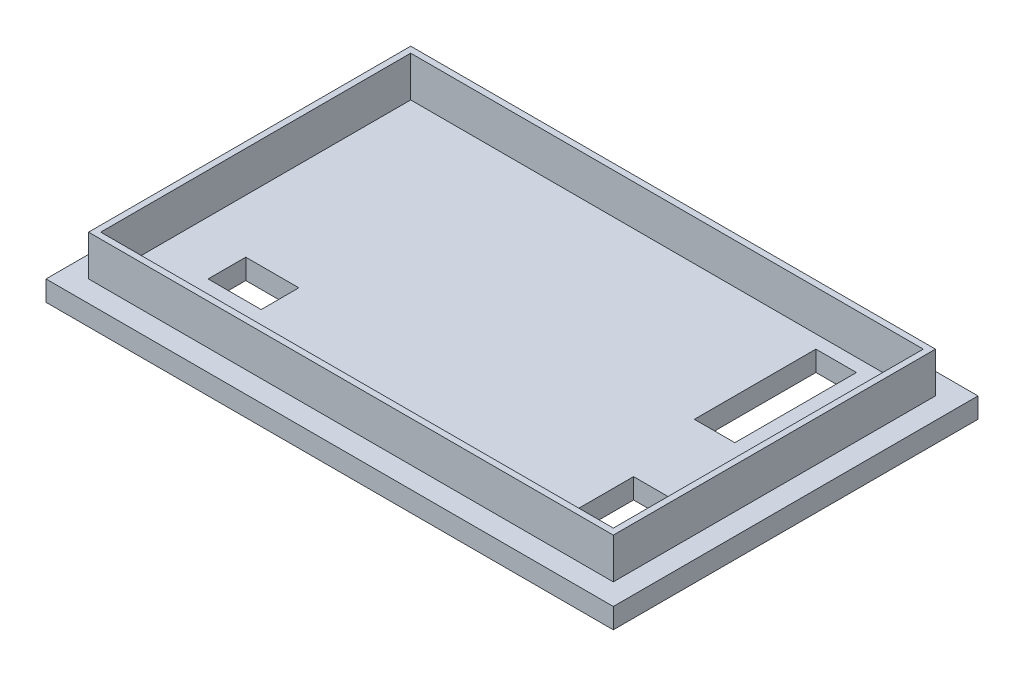
ISO-10303-21;
HEADER;
FILE_DESCRIPTION(('STEP AP214'),'2;1');
FILE_NAME('part.step','',(''),(''),'','','');
FILE_SCHEMA(('AUTOMOTIVE_DESIGN { 1 0 10303 214 1 1 1 1 }'));
ENDSEC;
DATA;
#1=APPLICATION_CONTEXT('core data for automotive mechanical design processes');
#2=APPLICATION_PROTOCOL_DEFINITION('international standard','automotive_design',2000,#1);
#3=PRODUCT_CONTEXT('',#1,'mechanical');
#4=PRODUCT('Part','Part','',(#3));
#5=PRODUCT_RELATED_PRODUCT_CATEGORY('part','',(#4));
#6=PRODUCT_DEFINITION_FORMATION('','',#4);
#7=PRODUCT_DEFINITION_CONTEXT('part definition',#1,'design');
#8=PRODUCT_DEFINITION('design','',#6,#7);
#9=PRODUCT_DEFINITION_SHAPE('','',#8);
#10=(LENGTH_UNIT() NAMED_UNIT(*) SI_UNIT(.MILLI.,.METRE.));
#11=(NAMED_UNIT(*) PLANE_ANGLE_UNIT() SI_UNIT($,.RADIAN.));
#12=(NAMED_UNIT(*) SI_UNIT($,.STERADIAN.) SOLID_ANGLE_UNIT());
#13=UNCERTAINTY_MEASURE_WITH_UNIT(LENGTH_MEASURE(1.E-05),#10,'distance_accuracy_value','');
#14=(GEOMETRIC_REPRESENTATION_CONTEXT(3) GLOBAL_UNCERTAINTY_ASSIGNED_CONTEXT((#13)) GLOBAL_UNIT_ASSIGNED_CONTEXT((#10,
#11,#12)) REPRESENTATION_CONTEXT('',''));
#15=CARTESIAN_POINT('',(0.,0.,0.));
#16=DIRECTION('',(0.,0.,1.));
#17=DIRECTION('',(1.,0.,0.));
#18=AXIS2_PLACEMENT_3D('',#15,#16,#17);
#19=CARTESIAN_POINT('',(0.,5.,0.));
#20=DIRECTION('',(0.,1.,0.));
#21=DIRECTION('',(0.,0.,1.));
#22=AXIS2_PLACEMENT_3D('',#19,#20,#21);
#23=PLANE('',#22);
#24=DIRECTION('',(0.,0.,-1.));
#25=VECTOR('',#24,1.);
#26=CARTESIAN_POINT('',(70.,5.,-45.));
#27=LINE('',#26,#25);
#28=CARTESIAN_POINT('',(70.,5.,45.));
#29=VERTEX_POINT('',#28);
#30=CARTESIAN_POINT('',(70.,5.,-45.));
#31=VERTEX_POINT('',#30);
#32=EDGE_CURVE('E336',#29,#31,#27,.T.);
#33=ORIENTED_EDGE('',*,*,#32,.T.);
#34=DIRECTION('',(-1.,0.,0.));
#35=VECTOR('',#34,1.);
#36=CARTESIAN_POINT('',(-70.,5.,-45.));
#37=LINE('',#36,#35);
#38=CARTESIAN_POINT('',(-70.,5.,-45.));
#39=VERTEX_POINT('',#38);
#40=EDGE_CURVE('E339',#31,#39,#37,.T.);
#41=ORIENTED_EDGE('',*,*,#40,.T.);
#42=DIRECTION('',(0.,0.,1.));
#43=VECTOR('',#42,1.);
#44=CARTESIAN_POINT('',(-70.,5.,-45.));
#45=LINE('',#44,#43);
#46=CARTESIAN_POINT('',(-70.,5.,45.));
#47=VERTEX_POINT('',#46);
#48=EDGE_CURVE('E342',#39,#47,#45,.T.);
#49=ORIENTED_EDGE('',*,*,#48,.T.);
#50=DIRECTION('',(1.,0.,0.));
#51=VECTOR('',#50,1.);
#52=CARTESIAN_POINT('',(-70.,5.,45.));
#53=LINE('',#52,#51);
#54=EDGE_CURVE('E344',#47,#29,#53,.T.);
#55=ORIENTED_EDGE('',*,*,#54,.T.);
#56=EDGE_LOOP('',(#33,#41,#49,#55));
#57=FACE_BOUND('',#56,.T.);
#58=DIRECTION('',(-1.,0.,0.));
#59=VECTOR('',#58,1.);
#60=CARTESIAN_POINT('',(-64.75,5.,-39.75));
#61=LINE('',#60,#59);
#62=CARTESIAN_POINT('',(64.75,5.,-39.75));
#63=VERTEX_POINT('',#62);
#64=CARTESIAN_POINT('',(-64.75,5.,-39.75));
#65=VERTEX_POINT('',#64);
#66=EDGE_CURVE('E320',#63,#65,#61,.T.);
#67=ORIENTED_EDGE('',*,*,#66,.F.);
#68=DIRECTION('',(0.,0.,-1.));
#69=VECTOR('',#68,1.);
#70=CARTESIAN_POINT('',(64.75,5.,-39.75));
#71=LINE('',#70,#69);
#72=CARTESIAN_POINT('',(64.75,5.,39.75));
#73=VERTEX_POINT('',#72);
#74=EDGE_CURVE('E306',#73,#63,#71,.T.);
#75=ORIENTED_EDGE('',*,*,#74,.F.);
#76=DIRECTION('',(1.,0.,0.));
#77=VECTOR('',#76,1.);
#78=CARTESIAN_POINT('',(-64.75,5.,39.75));
#79=LINE('',#78,#77);
#80=CARTESIAN_POINT('',(-64.75,5.,39.75));
#81=VERTEX_POINT('',#80);
#82=EDGE_CURVE('E311',#81,#73,#79,.T.);
#83=ORIENTED_EDGE('',*,*,#82,.F.);
#84=DIRECTION('',(0.,0.,1.));
#85=VECTOR('',#84,1.);
#86=CARTESIAN_POINT('',(-64.75,5.,-39.75));
#87=LINE('',#86,#85);
#88=EDGE_CURVE('E322',#65,#81,#87,.T.);
#89=ORIENTED_EDGE('',*,*,#88,.F.);
#90=EDGE_LOOP('',(#67,#75,#83,#89));
#91=FACE_BOUND('',#90,.T.);
#92=ADVANCED_FACE('F37',(#57,#91),#23,.T.);
#93=CARTESIAN_POINT('',(70.,5.,-45.));
#94=DIRECTION('',(-1.,0.,0.));
#95=DIRECTION('',(0.,0.,1.));
#96=AXIS2_PLACEMENT_3D('',#93,#94,#95);
#97=PLANE('',#96);
#98=DIRECTION('',(0.,0.,-1.));
#99=VECTOR('',#98,1.);
#100=CARTESIAN_POINT('',(70.,0.,-45.));
#101=LINE('',#100,#99);
#102=CARTESIAN_POINT('',(70.,0.,45.));
#103=VERTEX_POINT('',#102);
#104=CARTESIAN_POINT('',(70.,0.,-45.));
#105=VERTEX_POINT('',#104);
#106=EDGE_CURVE('E335',#103,#105,#101,.T.);
#107=ORIENTED_EDGE('',*,*,#106,.T.);
#108=DIRECTION('',(0.,-1.,0.));
#109=VECTOR('',#108,1.);
#110=CARTESIAN_POINT('',(70.,5.,-45.));
#111=LINE('',#110,#109);
#112=EDGE_CURVE('E362',#31,#105,#111,.T.);
#113=ORIENTED_EDGE('',*,*,#112,.F.);
#114=ORIENTED_EDGE('',*,*,#32,.F.);
#115=DIRECTION('',(0.,-1.,0.));
#116=VECTOR('',#115,1.);
#117=CARTESIAN_POINT('',(70.,5.,45.));
#118=LINE('',#117,#116);
#119=EDGE_CURVE('E346',#29,#103,#118,.T.);
#120=ORIENTED_EDGE('',*,*,#119,.T.);
#121=EDGE_LOOP('',(#107,#113,#114,#120));
#122=FACE_BOUND('',#121,.T.);
#123=ADVANCED_FACE('F39',(#122),#97,.F.);
#124=CARTESIAN_POINT('',(-70.,5.,-45.));
#125=DIRECTION('',(0.,0.,1.));
#126=DIRECTION('',(1.,0.,0.));
#127=AXIS2_PLACEMENT_3D('',#124,#125,#126);
#128=PLANE('',#127);
#129=DIRECTION('',(-1.,0.,0.));
#130=VECTOR('',#129,1.);
#131=CARTESIAN_POINT('',(-70.,0.,-45.));
#132=LINE('',#131,#130);
#133=CARTESIAN_POINT('',(-70.,0.,-45.));
#134=VERTEX_POINT('',#133);
#135=EDGE_CURVE('E349',#105,#134,#132,.T.);
#136=ORIENTED_EDGE('',*,*,#135,.T.);
#137=DIRECTION('',(0.,-1.,0.));
#138=VECTOR('',#137,1.);
#139=CARTESIAN_POINT('',(-70.,5.,-45.));
#140=LINE('',#139,#138);
#141=EDGE_CURVE('E359',#39,#134,#140,.T.);
#142=ORIENTED_EDGE('',*,*,#141,.F.);
#143=ORIENTED_EDGE('',*,*,#40,.F.);
#144=ORIENTED_EDGE('',*,*,#112,.T.);
#145=EDGE_LOOP('',(#136,#142,#143,#144));
#146=FACE_BOUND('',#145,.T.);
#147=ADVANCED_FACE('F404',(#146),#128,.F.);
#148=CARTESIAN_POINT('',(-70.,5.,-45.));
#149=DIRECTION('',(1.,0.,0.));
#150=DIRECTION('',(0.,0.,-1.));
#151=AXIS2_PLACEMENT_3D('',#148,#149,#150);
#152=PLANE('',#151);
#153=DIRECTION('',(0.,0.,1.));
#154=VECTOR('',#153,1.);
#155=CARTESIAN_POINT('',(-70.,0.,-45.));
#156=LINE('',#155,#154);
#157=CARTESIAN_POINT('',(-70.,0.,45.));
#158=VERTEX_POINT('',#157);
#159=EDGE_CURVE('E351',#134,#158,#156,.T.);
#160=ORIENTED_EDGE('',*,*,#159,.T.);
#161=DIRECTION('',(0.,-1.,0.));
#162=VECTOR('',#161,1.);
#163=CARTESIAN_POINT('',(-70.,5.,45.));
#164=LINE('',#163,#162);
#165=EDGE_CURVE('E356',#47,#158,#164,.T.);
#166=ORIENTED_EDGE('',*,*,#165,.F.);
#167=ORIENTED_EDGE('',*,*,#48,.F.);
#168=ORIENTED_EDGE('',*,*,#141,.T.);
#169=EDGE_LOOP('',(#160,#166,#167,#168));
#170=FACE_BOUND('',#169,.T.);
#171=ADVANCED_FACE('F691',(#170),#152,.F.);
#172=CARTESIAN_POINT('',(-70.,5.,45.));
#173=DIRECTION('',(0.,0.,-1.));
#174=DIRECTION('',(-1.,0.,0.));
#175=AXIS2_PLACEMENT_3D('',#172,#173,#174);
#176=PLANE('',#175);
#177=DIRECTION('',(1.,0.,0.));
#178=VECTOR('',#177,1.);
#179=CARTESIAN_POINT('',(-70.,0.,45.));
#180=LINE('',#179,#178);
#181=EDGE_CURVE('E340',#158,#103,#180,.T.);
#182=ORIENTED_EDGE('',*,*,#181,.T.);
#183=ORIENTED_EDGE('',*,*,#119,.F.);
#184=ORIENTED_EDGE('',*,*,#54,.F.);
#185=ORIENTED_EDGE('',*,*,#165,.T.);
#186=EDGE_LOOP('',(#182,#183,#184,#185));
#187=FACE_BOUND('',#186,.T.);
#188=ADVANCED_FACE('F598',(#187),#176,.F.);
#189=CARTESIAN_POINT('',(0.,0.,0.));
#190=DIRECTION('',(0.,1.,0.));
#191=DIRECTION('',(0.,0.,1.));
#192=AXIS2_PLACEMENT_3D('',#189,#190,#191);
#193=PLANE('',#192);
#194=DIRECTION('',(-1.,0.,0.));
#195=VECTOR('',#194,1.);
#196=CARTESIAN_POINT('',(40.,0.,-5.));
#197=LINE('',#196,#195);
#198=CARTESIAN_POINT('',(50.,0.,-5.));
#199=VERTEX_POINT('',#198);
#200=CARTESIAN_POINT('',(40.,0.,-5.));
#201=VERTEX_POINT('',#200);
#202=EDGE_CURVE('E209',#199,#201,#197,.T.);
#203=ORIENTED_EDGE('',*,*,#202,.F.);
#204=DIRECTION('',(0.,0.,1.));
#205=VECTOR('',#204,1.);
#206=CARTESIAN_POINT('',(50.,0.,-35.));
#207=LINE('',#206,#205);
#208=CARTESIAN_POINT('',(50.,0.,-35.));
#209=VERTEX_POINT('',#208);
#210=EDGE_CURVE('E52',#209,#199,#207,.T.);
#211=ORIENTED_EDGE('',*,*,#210,.F.);
#212=DIRECTION('',(1.,0.,0.));
#213=VECTOR('',#212,1.);
#214=CARTESIAN_POINT('',(40.,0.,-35.));
#215=LINE('',#214,#213);
#216=CARTESIAN_POINT('',(40.,0.,-35.));
#217=VERTEX_POINT('',#216);
#218=EDGE_CURVE('E216',#217,#209,#215,.T.);
#219=ORIENTED_EDGE('',*,*,#218,.F.);
#220=DIRECTION('',(0.,0.,-1.));
#221=VECTOR('',#220,1.);
#222=CARTESIAN_POINT('',(40.,0.,-35.));
#223=LINE('',#222,#221);
#224=EDGE_CURVE('E200',#201,#217,#223,.T.);
#225=ORIENTED_EDGE('',*,*,#224,.F.);
#226=EDGE_LOOP('',(#203,#211,#219,#225));
#227=FACE_BOUND('',#226,.T.);
#228=DIRECTION('',(-1.,0.,0.));
#229=VECTOR('',#228,1.);
#230=CARTESIAN_POINT('',(-50.,0.,25.));
#231=LINE('',#230,#229);
#232=CARTESIAN_POINT('',(-36.9,0.,25.));
#233=VERTEX_POINT('',#232);
#234=CARTESIAN_POINT('',(-50.,0.,25.));
#235=VERTEX_POINT('',#234);
#236=EDGE_CURVE('E227',#233,#235,#231,.T.);
#237=ORIENTED_EDGE('',*,*,#236,.F.);
#238=DIRECTION('',(0.,0.,1.));
#239=VECTOR('',#238,1.);
#240=CARTESIAN_POINT('',(-36.9,0.,25.));
#241=LINE('',#240,#239);
#242=CARTESIAN_POINT('',(-36.9,0.,15.7));
#243=VERTEX_POINT('',#242);
#244=EDGE_CURVE('E223',#243,#233,#241,.T.);
#245=ORIENTED_EDGE('',*,*,#244,.F.);
#246=DIRECTION('',(1.,0.,0.));
#247=VECTOR('',#246,1.);
#248=CARTESIAN_POINT('',(-50.,0.,15.7));
#249=LINE('',#248,#247);
#250=CARTESIAN_POINT('',(-50.,0.,15.7));
#251=VERTEX_POINT('',#250);
#252=EDGE_CURVE('E233',#251,#243,#249,.T.);
#253=ORIENTED_EDGE('',*,*,#252,.F.);
#254=DIRECTION('',(0.,0.,-1.));
#255=VECTOR('',#254,1.);
#256=CARTESIAN_POINT('',(-50.,0.,25.));
#257=LINE('',#256,#255);
#258=EDGE_CURVE('E230',#235,#251,#257,.T.);
#259=ORIENTED_EDGE('',*,*,#258,.F.);
#260=EDGE_LOOP('',(#237,#245,#253,#259));
#261=FACE_BOUND('',#260,.T.);
#262=DIRECTION('',(1.,0.,0.));
#263=VECTOR('',#262,1.);
#264=CARTESIAN_POINT('',(44.75,0.,34.75));
#265=LINE('',#264,#263);
#266=CARTESIAN_POINT('',(44.75,0.,34.75));
#267=VERTEX_POINT('',#266);
#268=CARTESIAN_POINT('',(59.75,0.,34.75));
#269=VERTEX_POINT('',#268);
#270=EDGE_CURVE('E256',#267,#269,#265,.T.);
#271=ORIENTED_EDGE('',*,*,#270,.T.);
#272=DIRECTION('',(0.,0.,-1.));
#273=VECTOR('',#272,1.);
#274=CARTESIAN_POINT('',(59.75,0.,14.75));
#275=LINE('',#274,#273);
#276=CARTESIAN_POINT('',(59.75,0.,14.75));
#277=VERTEX_POINT('',#276);
#278=EDGE_CURVE('E246',#269,#277,#275,.T.);
#279=ORIENTED_EDGE('',*,*,#278,.T.);
#280=DIRECTION('',(-1.,0.,0.));
#281=VECTOR('',#280,1.);
#282=CARTESIAN_POINT('',(44.75,0.,14.75));
#283=LINE('',#282,#281);
#284=CARTESIAN_POINT('',(44.75,0.,14.75));
#285=VERTEX_POINT('',#284);
#286=EDGE_CURVE('E249',#277,#285,#283,.T.);
#287=ORIENTED_EDGE('',*,*,#286,.T.);
#288=DIRECTION('',(0.,0.,1.));
#289=VECTOR('',#288,1.);
#290=CARTESIAN_POINT('',(44.75,0.,14.75));
#291=LINE('',#290,#289);
#292=EDGE_CURVE('E253',#285,#267,#291,.T.);
#293=ORIENTED_EDGE('',*,*,#292,.T.);
#294=EDGE_LOOP('',(#271,#279,#287,#293));
#295=FACE_BOUND('',#294,.T.);
#296=ORIENTED_EDGE('',*,*,#106,.F.);
#297=ORIENTED_EDGE('',*,*,#181,.F.);
#298=ORIENTED_EDGE('',*,*,#159,.F.);
#299=ORIENTED_EDGE('',*,*,#135,.F.);
#300=EDGE_LOOP('',(#296,#297,#298,#299));
#301=FACE_BOUND('',#300,.T.);
#302=ADVANCED_FACE('F213',(#227,#261,#295,#301),#193,.F.);
#303=CARTESIAN_POINT('',(0.,15.,0.));
#304=DIRECTION('',(0.,1.,0.));
#305=DIRECTION('',(0.,0.,1.));
#306=AXIS2_PLACEMENT_3D('',#303,#304,#305);
#307=PLANE('',#306);
#308=DIRECTION('',(0.,0.,-1.));
#309=VECTOR('',#308,1.);
#310=CARTESIAN_POINT('',(64.75,15.,-39.75));
#311=LINE('',#310,#309);
#312=CARTESIAN_POINT('',(64.75,15.,39.75));
#313=VERTEX_POINT('',#312);
#314=CARTESIAN_POINT('',(64.75,15.,-39.75));
#315=VERTEX_POINT('',#314);
#316=EDGE_CURVE('E307',#313,#315,#311,.T.);
#317=ORIENTED_EDGE('',*,*,#316,.T.);
#318=DIRECTION('',(-1.,0.,0.));
#319=VECTOR('',#318,1.);
#320=CARTESIAN_POINT('',(-64.75,15.,-39.75));
#321=LINE('',#320,#319);
#322=CARTESIAN_POINT('',(-64.75,15.,-39.75));
#323=VERTEX_POINT('',#322);
#324=EDGE_CURVE('E310',#315,#323,#321,.T.);
#325=ORIENTED_EDGE('',*,*,#324,.T.);
#326=DIRECTION('',(0.,0.,1.));
#327=VECTOR('',#326,1.);
#328=CARTESIAN_POINT('',(-64.75,15.,-39.75));
#329=LINE('',#328,#327);
#330=CARTESIAN_POINT('',(-64.75,15.,39.75));
#331=VERTEX_POINT('',#330);
#332=EDGE_CURVE('E313',#323,#331,#329,.T.);
#333=ORIENTED_EDGE('',*,*,#332,.T.);
#334=DIRECTION('',(1.,0.,0.));
#335=VECTOR('',#334,1.);
#336=CARTESIAN_POINT('',(-64.75,15.,39.75));
#337=LINE('',#336,#335);
#338=EDGE_CURVE('E315',#331,#313,#337,.T.);
#339=ORIENTED_EDGE('',*,*,#338,.T.);
#340=EDGE_LOOP('',(#317,#325,#333,#339));
#341=FACE_BOUND('',#340,.T.);
#342=DIRECTION('',(-1.,0.,0.));
#343=VECTOR('',#342,1.);
#344=CARTESIAN_POINT('',(-63.25,15.,-38.25));
#345=LINE('',#344,#343);
#346=CARTESIAN_POINT('',(63.25,15.,-38.25));
#347=VERTEX_POINT('',#346);
#348=CARTESIAN_POINT('',(-63.25,15.,-38.25));
#349=VERTEX_POINT('',#348);
#350=EDGE_CURVE('E280',#347,#349,#345,.T.);
#351=ORIENTED_EDGE('',*,*,#350,.F.);
#352=DIRECTION('',(0.,0.,-1.));
#353=VECTOR('',#352,1.);
#354=CARTESIAN_POINT('',(63.25,15.,-38.25));
#355=LINE('',#354,#353);
#356=CARTESIAN_POINT('',(63.25,15.,38.25));
#357=VERTEX_POINT('',#356);
#358=EDGE_CURVE('E278',#357,#347,#355,.T.);
#359=ORIENTED_EDGE('',*,*,#358,.F.);
#360=DIRECTION('',(1.,0.,0.));
#361=VECTOR('',#360,1.);
#362=CARTESIAN_POINT('',(-63.25,15.,38.25));
#363=LINE('',#362,#361);
#364=CARTESIAN_POINT('',(-63.25,15.,38.25));
#365=VERTEX_POINT('',#364);
#366=EDGE_CURVE('E286',#365,#357,#363,.T.);
#367=ORIENTED_EDGE('',*,*,#366,.F.);
#368=DIRECTION('',(0.,0.,1.));
#369=VECTOR('',#368,1.);
#370=CARTESIAN_POINT('',(-63.25,15.,-38.25));
#371=LINE('',#370,#369);
#372=EDGE_CURVE('E283',#349,#365,#371,.T.);
#373=ORIENTED_EDGE('',*,*,#372,.F.);
#374=EDGE_LOOP('',(#351,#359,#367,#373));
#375=FACE_BOUND('',#374,.T.);
#376=ADVANCED_FACE('F439',(#341,#375),#307,.T.);
#377=CARTESIAN_POINT('',(64.75,15.,-39.75));
#378=DIRECTION('',(-1.,0.,0.));
#379=DIRECTION('',(0.,0.,1.));
#380=AXIS2_PLACEMENT_3D('',#377,#378,#379);
#381=PLANE('',#380);
#382=ORIENTED_EDGE('',*,*,#74,.T.);
#383=DIRECTION('',(0.,-1.,0.));
#384=VECTOR('',#383,1.);
#385=CARTESIAN_POINT('',(64.75,15.,-39.75));
#386=LINE('',#385,#384);
#387=EDGE_CURVE('E333',#315,#63,#386,.T.);
#388=ORIENTED_EDGE('',*,*,#387,.F.);
#389=ORIENTED_EDGE('',*,*,#316,.F.);
#390=DIRECTION('',(0.,-1.,0.));
#391=VECTOR('',#390,1.);
#392=CARTESIAN_POINT('',(64.75,15.,39.75));
#393=LINE('',#392,#391);
#394=EDGE_CURVE('E317',#313,#73,#393,.T.);
#395=ORIENTED_EDGE('',*,*,#394,.T.);
#396=EDGE_LOOP('',(#382,#388,#389,#395));
#397=FACE_BOUND('',#396,.T.);
#398=ADVANCED_FACE('F442',(#397),#381,.F.);
#399=CARTESIAN_POINT('',(-64.75,15.,-39.75));
#400=DIRECTION('',(0.,0.,1.));
#401=DIRECTION('',(1.,0.,0.));
#402=AXIS2_PLACEMENT_3D('',#399,#400,#401);
#403=PLANE('',#402);
#404=ORIENTED_EDGE('',*,*,#66,.T.);
#405=DIRECTION('',(0.,-1.,0.));
#406=VECTOR('',#405,1.);
#407=CARTESIAN_POINT('',(-64.75,15.,-39.75));
#408=LINE('',#407,#406);
#409=EDGE_CURVE('E330',#323,#65,#408,.T.);
#410=ORIENTED_EDGE('',*,*,#409,.F.);
#411=ORIENTED_EDGE('',*,*,#324,.F.);
#412=ORIENTED_EDGE('',*,*,#387,.T.);
#413=EDGE_LOOP('',(#404,#410,#411,#412));
#414=FACE_BOUND('',#413,.T.);
#415=ADVANCED_FACE('F450',(#414),#403,.F.);
#416=CARTESIAN_POINT('',(-64.75,15.,-39.75));
#417=DIRECTION('',(1.,0.,0.));
#418=DIRECTION('',(0.,0.,-1.));
#419=AXIS2_PLACEMENT_3D('',#416,#417,#418);
#420=PLANE('',#419);
#421=ORIENTED_EDGE('',*,*,#88,.T.);
#422=DIRECTION('',(0.,-1.,0.));
#423=VECTOR('',#422,1.);
#424=CARTESIAN_POINT('',(-64.75,15.,39.75));
#425=LINE('',#424,#423);
#426=EDGE_CURVE('E328',#331,#81,#425,.T.);
#427=ORIENTED_EDGE('',*,*,#426,.F.);
#428=ORIENTED_EDGE('',*,*,#332,.F.);
#429=ORIENTED_EDGE('',*,*,#409,.T.);
#430=EDGE_LOOP('',(#421,#427,#428,#429));
#431=FACE_BOUND('',#430,.T.);
#432=ADVANCED_FACE('F446',(#431),#420,.F.);
#433=CARTESIAN_POINT('',(-64.75,15.,39.75));
#434=DIRECTION('',(0.,0.,-1.));
#435=DIRECTION('',(-1.,0.,0.));
#436=AXIS2_PLACEMENT_3D('',#433,#434,#435);
#437=PLANE('',#436);
#438=ORIENTED_EDGE('',*,*,#82,.T.);
#439=ORIENTED_EDGE('',*,*,#394,.F.);
#440=ORIENTED_EDGE('',*,*,#338,.F.);
#441=ORIENTED_EDGE('',*,*,#426,.T.);
#442=EDGE_LOOP('',(#438,#439,#440,#441));
#443=FACE_BOUND('',#442,.T.);
#444=ADVANCED_FACE('F437',(#443),#437,.F.);
#445=CARTESIAN_POINT('',(63.25,15.,-38.25));
#446=DIRECTION('',(-1.,0.,0.));
#447=DIRECTION('',(0.,0.,1.));
#448=AXIS2_PLACEMENT_3D('',#445,#446,#447);
#449=PLANE('',#448);
#450=DIRECTION('',(0.,0.,-1.));
#451=VECTOR('',#450,1.);
#452=CARTESIAN_POINT('',(63.25,5.,-38.25));
#453=LINE('',#452,#451);
#454=CARTESIAN_POINT('',(63.25,5.,38.25));
#455=VERTEX_POINT('',#454);
#456=CARTESIAN_POINT('',(63.25,5.,-38.25));
#457=VERTEX_POINT('',#456);
#458=EDGE_CURVE('E271',#455,#457,#453,.T.);
#459=ORIENTED_EDGE('',*,*,#458,.F.);
#460=DIRECTION('',(0.,-1.,0.));
#461=VECTOR('',#460,1.);
#462=CARTESIAN_POINT('',(63.25,15.,38.25));
#463=LINE('',#462,#461);
#464=EDGE_CURVE('E288',#357,#455,#463,.T.);
#465=ORIENTED_EDGE('',*,*,#464,.F.);
#466=ORIENTED_EDGE('',*,*,#358,.T.);
#467=DIRECTION('',(0.,-1.,0.));
#468=VECTOR('',#467,1.);
#469=CARTESIAN_POINT('',(63.25,15.,-38.25));
#470=LINE('',#469,#468);
#471=EDGE_CURVE('E303',#347,#457,#470,.T.);
#472=ORIENTED_EDGE('',*,*,#471,.T.);
#473=EDGE_LOOP('',(#459,#465,#466,#472));
#474=FACE_BOUND('',#473,.T.);
#475=ADVANCED_FACE('F433',(#474),#449,.T.);
#476=CARTESIAN_POINT('',(-63.25,15.,-38.25));
#477=DIRECTION('',(0.,0.,1.));
#478=DIRECTION('',(1.,0.,0.));
#479=AXIS2_PLACEMENT_3D('',#476,#477,#478);
#480=PLANE('',#479);
#481=DIRECTION('',(-1.,0.,0.));
#482=VECTOR('',#481,1.);
#483=CARTESIAN_POINT('',(-63.25,5.,-38.25));
#484=LINE('',#483,#482);
#485=CARTESIAN_POINT('',(-63.25,5.,-38.25));
#486=VERTEX_POINT('',#485);
#487=EDGE_CURVE('E290',#457,#486,#484,.T.);
#488=ORIENTED_EDGE('',*,*,#487,.F.);
#489=ORIENTED_EDGE('',*,*,#471,.F.);
#490=ORIENTED_EDGE('',*,*,#350,.T.);
#491=DIRECTION('',(0.,-1.,0.));
#492=VECTOR('',#491,1.);
#493=CARTESIAN_POINT('',(-63.25,15.,-38.25));
#494=LINE('',#493,#492);
#495=EDGE_CURVE('E300',#349,#486,#494,.T.);
#496=ORIENTED_EDGE('',*,*,#495,.T.);
#497=EDGE_LOOP('',(#488,#489,#490,#496));
#498=FACE_BOUND('',#497,.T.);
#499=ADVANCED_FACE('F425',(#498),#480,.T.);
#500=CARTESIAN_POINT('',(-63.25,15.,-38.25));
#501=DIRECTION('',(1.,0.,0.));
#502=DIRECTION('',(0.,0.,-1.));
#503=AXIS2_PLACEMENT_3D('',#500,#501,#502);
#504=PLANE('',#503);
#505=DIRECTION('',(0.,0.,1.));
#506=VECTOR('',#505,1.);
#507=CARTESIAN_POINT('',(-63.25,5.,-38.25));
#508=LINE('',#507,#506);
#509=CARTESIAN_POINT('',(-63.25,5.,38.25));
#510=VERTEX_POINT('',#509);
#511=EDGE_CURVE('E292',#486,#510,#508,.T.);
#512=ORIENTED_EDGE('',*,*,#511,.F.);
#513=ORIENTED_EDGE('',*,*,#495,.F.);
#514=ORIENTED_EDGE('',*,*,#372,.T.);
#515=DIRECTION('',(0.,-1.,0.));
#516=VECTOR('',#515,1.);
#517=CARTESIAN_POINT('',(-63.25,15.,38.25));
#518=LINE('',#517,#516);
#519=EDGE_CURVE('E297',#365,#510,#518,.T.);
#520=ORIENTED_EDGE('',*,*,#519,.T.);
#521=EDGE_LOOP('',(#512,#513,#514,#520));
#522=FACE_BOUND('',#521,.T.);
#523=ADVANCED_FACE('F419',(#522),#504,.T.);
#524=CARTESIAN_POINT('',(-63.25,15.,38.25));
#525=DIRECTION('',(0.,0.,-1.));
#526=DIRECTION('',(-1.,0.,0.));
#527=AXIS2_PLACEMENT_3D('',#524,#525,#526);
#528=PLANE('',#527);
#529=DIRECTION('',(1.,0.,0.));
#530=VECTOR('',#529,1.);
#531=CARTESIAN_POINT('',(-63.25,5.,38.25));
#532=LINE('',#531,#530);
#533=EDGE_CURVE('E281',#510,#455,#532,.T.);
#534=ORIENTED_EDGE('',*,*,#533,.F.);
#535=ORIENTED_EDGE('',*,*,#519,.F.);
#536=ORIENTED_EDGE('',*,*,#366,.T.);
#537=ORIENTED_EDGE('',*,*,#464,.T.);
#538=EDGE_LOOP('',(#534,#535,#536,#537));
#539=FACE_BOUND('',#538,.T.);
#540=ADVANCED_FACE('F411',(#539),#528,.T.);
#541=DIRECTION('',(0.,0.,-1.));
#542=VECTOR('',#541,1.);
#543=CARTESIAN_POINT('',(50.,5.,0.));
#544=LINE('',#543,#542);
#545=CARTESIAN_POINT('',(50.,5.,-5.));
#546=VERTEX_POINT('',#545);
#547=CARTESIAN_POINT('',(50.,5.,-35.));
#548=VERTEX_POINT('',#547);
#549=EDGE_CURVE('E11',#546,#548,#544,.T.);
#550=ORIENTED_EDGE('',*,*,#549,.F.);
#551=DIRECTION('',(1.,0.,0.));
#552=VECTOR('',#551,1.);
#553=CARTESIAN_POINT('',(0.,5.,-5.));
#554=LINE('',#553,#552);
#555=CARTESIAN_POINT('',(40.,5.,-5.));
#556=VERTEX_POINT('',#555);
#557=EDGE_CURVE('E374',#556,#546,#554,.T.);
#558=ORIENTED_EDGE('',*,*,#557,.F.);
#559=DIRECTION('',(0.,0.,1.));
#560=VECTOR('',#559,1.);
#561=CARTESIAN_POINT('',(40.,5.,0.));
#562=LINE('',#561,#560);
#563=CARTESIAN_POINT('',(40.,5.,-35.));
#564=VERTEX_POINT('',#563);
#565=EDGE_CURVE('E203',#564,#556,#562,.T.);
#566=ORIENTED_EDGE('',*,*,#565,.F.);
#567=DIRECTION('',(-1.,0.,0.));
#568=VECTOR('',#567,1.);
#569=CARTESIAN_POINT('',(0.,5.,-35.));
#570=LINE('',#569,#568);
#571=EDGE_CURVE('E45',#548,#564,#570,.T.);
#572=ORIENTED_EDGE('',*,*,#571,.F.);
#573=EDGE_LOOP('',(#550,#558,#566,#572));
#574=FACE_BOUND('',#573,.T.);
#575=DIRECTION('',(0.,0.,-1.));
#576=VECTOR('',#575,1.);
#577=CARTESIAN_POINT('',(-36.9,5.,0.));
#578=LINE('',#577,#576);
#579=CARTESIAN_POINT('',(-36.9,5.,25.));
#580=VERTEX_POINT('',#579);
#581=CARTESIAN_POINT('',(-36.9,5.,15.7));
#582=VERTEX_POINT('',#581);
#583=EDGE_CURVE('E372',#580,#582,#578,.T.);
#584=ORIENTED_EDGE('',*,*,#583,.F.);
#585=DIRECTION('',(1.,0.,0.));
#586=VECTOR('',#585,1.);
#587=CARTESIAN_POINT('',(0.,5.,25.));
#588=LINE('',#587,#586);
#589=CARTESIAN_POINT('',(-50.,5.,25.));
#590=VERTEX_POINT('',#589);
#591=EDGE_CURVE('E365',#590,#580,#588,.T.);
#592=ORIENTED_EDGE('',*,*,#591,.F.);
#593=DIRECTION('',(0.,0.,1.));
#594=VECTOR('',#593,1.);
#595=CARTESIAN_POINT('',(-50.,5.,0.));
#596=LINE('',#595,#594);
#597=CARTESIAN_POINT('',(-50.,5.,15.7));
#598=VERTEX_POINT('',#597);
#599=EDGE_CURVE('E367',#598,#590,#596,.T.);
#600=ORIENTED_EDGE('',*,*,#599,.F.);
#601=DIRECTION('',(-1.,0.,0.));
#602=VECTOR('',#601,1.);
#603=CARTESIAN_POINT('',(0.,5.,15.7));
#604=LINE('',#603,#602);
#605=EDGE_CURVE('E370',#582,#598,#604,.T.);
#606=ORIENTED_EDGE('',*,*,#605,.F.);
#607=EDGE_LOOP('',(#584,#592,#600,#606));
#608=FACE_BOUND('',#607,.T.);
#609=DIRECTION('',(0.,0.,-1.));
#610=VECTOR('',#609,1.);
#611=CARTESIAN_POINT('',(59.75,5.,14.75));
#612=LINE('',#611,#610);
#613=CARTESIAN_POINT('',(59.75,5.,34.75));
#614=VERTEX_POINT('',#613);
#615=CARTESIAN_POINT('',(59.75,5.,14.75));
#616=VERTEX_POINT('',#615);
#617=EDGE_CURVE('E239',#614,#616,#612,.T.);
#618=ORIENTED_EDGE('',*,*,#617,.F.);
#619=DIRECTION('',(1.,0.,0.));
#620=VECTOR('',#619,1.);
#621=CARTESIAN_POINT('',(44.75,5.,34.75));
#622=LINE('',#621,#620);
#623=CARTESIAN_POINT('',(44.75,5.,34.75));
#624=VERTEX_POINT('',#623);
#625=EDGE_CURVE('E250',#624,#614,#622,.T.);
#626=ORIENTED_EDGE('',*,*,#625,.F.);
#627=DIRECTION('',(0.,0.,1.));
#628=VECTOR('',#627,1.);
#629=CARTESIAN_POINT('',(44.75,5.,14.75));
#630=LINE('',#629,#628);
#631=CARTESIAN_POINT('',(44.75,5.,14.75));
#632=VERTEX_POINT('',#631);
#633=EDGE_CURVE('E264',#632,#624,#630,.T.);
#634=ORIENTED_EDGE('',*,*,#633,.F.);
#635=DIRECTION('',(-1.,0.,0.));
#636=VECTOR('',#635,1.);
#637=CARTESIAN_POINT('',(44.75,5.,14.75));
#638=LINE('',#637,#636);
#639=EDGE_CURVE('E261',#616,#632,#638,.T.);
#640=ORIENTED_EDGE('',*,*,#639,.F.);
#641=EDGE_LOOP('',(#618,#626,#634,#640));
#642=FACE_BOUND('',#641,.T.);
#643=ORIENTED_EDGE('',*,*,#458,.T.);
#644=ORIENTED_EDGE('',*,*,#487,.T.);
#645=ORIENTED_EDGE('',*,*,#511,.T.);
#646=ORIENTED_EDGE('',*,*,#533,.T.);
#647=EDGE_LOOP('',(#643,#644,#645,#646));
#648=FACE_BOUND('',#647,.T.);
#649=ADVANCED_FACE('F382',(#574,#608,#642,#648),#23,.T.);
#650=CARTESIAN_POINT('',(59.75,0.,14.75));
#651=DIRECTION('',(1.,0.,0.));
#652=DIRECTION('',(0.,0.,-1.));
#653=AXIS2_PLACEMENT_3D('',#650,#651,#652);
#654=PLANE('',#653);
#655=ORIENTED_EDGE('',*,*,#617,.T.);
#656=DIRECTION('',(0.,1.,0.));
#657=VECTOR('',#656,1.);
#658=CARTESIAN_POINT('',(59.75,0.,14.75));
#659=LINE('',#658,#657);
#660=EDGE_CURVE('E259',#277,#616,#659,.T.);
#661=ORIENTED_EDGE('',*,*,#660,.F.);
#662=ORIENTED_EDGE('',*,*,#278,.F.);
#663=DIRECTION('',(0.,1.,0.));
#664=VECTOR('',#663,1.);
#665=CARTESIAN_POINT('',(59.75,0.,34.75));
#666=LINE('',#665,#664);
#667=EDGE_CURVE('E269',#269,#614,#666,.T.);
#668=ORIENTED_EDGE('',*,*,#667,.T.);
#669=EDGE_LOOP('',(#655,#661,#662,#668));
#670=FACE_BOUND('',#669,.T.);
#671=ADVANCED_FACE('F410',(#670),#654,.F.);
#672=CARTESIAN_POINT('',(44.75,0.,34.75));
#673=DIRECTION('',(0.,0.,1.));
#674=DIRECTION('',(1.,0.,0.));
#675=AXIS2_PLACEMENT_3D('',#672,#673,#674);
#676=PLANE('',#675);
#677=ORIENTED_EDGE('',*,*,#625,.T.);
#678=ORIENTED_EDGE('',*,*,#667,.F.);
#679=ORIENTED_EDGE('',*,*,#270,.F.);
#680=DIRECTION('',(0.,1.,0.));
#681=VECTOR('',#680,1.);
#682=CARTESIAN_POINT('',(44.75,0.,34.75));
#683=LINE('',#682,#681);
#684=EDGE_CURVE('E272',#267,#624,#683,.T.);
#685=ORIENTED_EDGE('',*,*,#684,.T.);
#686=EDGE_LOOP('',(#677,#678,#679,#685));
#687=FACE_BOUND('',#686,.T.);
#688=ADVANCED_FACE('F416',(#687),#676,.F.);
#689=CARTESIAN_POINT('',(44.75,0.,14.75));
#690=DIRECTION('',(-1.,0.,0.));
#691=DIRECTION('',(0.,0.,1.));
#692=AXIS2_PLACEMENT_3D('',#689,#690,#691);
#693=PLANE('',#692);
#694=ORIENTED_EDGE('',*,*,#633,.T.);
#695=ORIENTED_EDGE('',*,*,#684,.F.);
#696=ORIENTED_EDGE('',*,*,#292,.F.);
#697=DIRECTION('',(0.,1.,0.));
#698=VECTOR('',#697,1.);
#699=CARTESIAN_POINT('',(44.75,0.,14.75));
#700=LINE('',#699,#698);
#701=EDGE_CURVE('E274',#285,#632,#700,.T.);
#702=ORIENTED_EDGE('',*,*,#701,.T.);
#703=EDGE_LOOP('',(#694,#695,#696,#702));
#704=FACE_BOUND('',#703,.T.);
#705=ADVANCED_FACE('F530',(#704),#693,.F.);
#706=CARTESIAN_POINT('',(44.75,0.,14.75));
#707=DIRECTION('',(0.,0.,-1.));
#708=DIRECTION('',(-1.,0.,0.));
#709=AXIS2_PLACEMENT_3D('',#706,#707,#708);
#710=PLANE('',#709);
#711=ORIENTED_EDGE('',*,*,#639,.T.);
#712=ORIENTED_EDGE('',*,*,#701,.F.);
#713=ORIENTED_EDGE('',*,*,#286,.F.);
#714=ORIENTED_EDGE('',*,*,#660,.T.);
#715=EDGE_LOOP('',(#711,#712,#713,#714));
#716=FACE_BOUND('',#715,.T.);
#717=ADVANCED_FACE('F541',(#716),#710,.F.);
#718=CARTESIAN_POINT('',(-36.9,15.,25.));
#719=DIRECTION('',(1.,0.,0.));
#720=DIRECTION('',(0.,0.,-1.));
#721=AXIS2_PLACEMENT_3D('',#718,#719,#720);
#722=PLANE('',#721);
#723=ORIENTED_EDGE('',*,*,#583,.T.);
#724=DIRECTION('',(0.,-1.,0.));
#725=VECTOR('',#724,1.);
#726=CARTESIAN_POINT('',(-36.9,15.,15.7));
#727=LINE('',#726,#725);
#728=EDGE_CURVE('E237',#582,#243,#727,.T.);
#729=ORIENTED_EDGE('',*,*,#728,.T.);
#730=ORIENTED_EDGE('',*,*,#244,.T.);
#731=DIRECTION('',(0.,-1.,0.));
#732=VECTOR('',#731,1.);
#733=CARTESIAN_POINT('',(-36.9,15.,25.));
#734=LINE('',#733,#732);
#735=EDGE_CURVE('E236',#580,#233,#734,.T.);
#736=ORIENTED_EDGE('',*,*,#735,.F.);
#737=EDGE_LOOP('',(#723,#729,#730,#736));
#738=FACE_BOUND('',#737,.T.);
#739=ADVANCED_FACE('F552',(#738),#722,.F.);
#740=CARTESIAN_POINT('',(-50.,15.,15.7));
#741=DIRECTION('',(0.,0.,-1.));
#742=DIRECTION('',(-1.,0.,0.));
#743=AXIS2_PLACEMENT_3D('',#740,#741,#742);
#744=PLANE('',#743);
#745=ORIENTED_EDGE('',*,*,#605,.T.);
#746=DIRECTION('',(0.,-1.,0.));
#747=VECTOR('',#746,1.);
#748=CARTESIAN_POINT('',(-50.,15.,15.7));
#749=LINE('',#748,#747);
#750=EDGE_CURVE('E240',#598,#251,#749,.T.);
#751=ORIENTED_EDGE('',*,*,#750,.T.);
#752=ORIENTED_EDGE('',*,*,#252,.T.);
#753=ORIENTED_EDGE('',*,*,#728,.F.);
#754=EDGE_LOOP('',(#745,#751,#752,#753));
#755=FACE_BOUND('',#754,.T.);
#756=ADVANCED_FACE('F562',(#755),#744,.F.);
#757=CARTESIAN_POINT('',(-50.,15.,25.));
#758=DIRECTION('',(-1.,0.,0.));
#759=DIRECTION('',(0.,0.,1.));
#760=AXIS2_PLACEMENT_3D('',#757,#758,#759);
#761=PLANE('',#760);
#762=ORIENTED_EDGE('',*,*,#599,.T.);
#763=DIRECTION('',(0.,-1.,0.));
#764=VECTOR('',#763,1.);
#765=CARTESIAN_POINT('',(-50.,15.,25.));
#766=LINE('',#765,#764);
#767=EDGE_CURVE('E242',#590,#235,#766,.T.);
#768=ORIENTED_EDGE('',*,*,#767,.T.);
#769=ORIENTED_EDGE('',*,*,#258,.T.);
#770=ORIENTED_EDGE('',*,*,#750,.F.);
#771=EDGE_LOOP('',(#762,#768,#769,#770));
#772=FACE_BOUND('',#771,.T.);
#773=ADVANCED_FACE('F393',(#772),#761,.F.);
#774=CARTESIAN_POINT('',(-50.,15.,25.));
#775=DIRECTION('',(0.,0.,1.));
#776=DIRECTION('',(1.,0.,0.));
#777=AXIS2_PLACEMENT_3D('',#774,#775,#776);
#778=PLANE('',#777);
#779=ORIENTED_EDGE('',*,*,#591,.T.);
#780=ORIENTED_EDGE('',*,*,#735,.T.);
#781=ORIENTED_EDGE('',*,*,#236,.T.);
#782=ORIENTED_EDGE('',*,*,#767,.F.);
#783=EDGE_LOOP('',(#779,#780,#781,#782));
#784=FACE_BOUND('',#783,.T.);
#785=ADVANCED_FACE('F386',(#784),#778,.F.);
#786=CARTESIAN_POINT('',(50.,15.,-35.));
#787=DIRECTION('',(1.,0.,0.));
#788=DIRECTION('',(0.,0.,-1.));
#789=AXIS2_PLACEMENT_3D('',#786,#787,#788);
#790=PLANE('',#789);
#791=ORIENTED_EDGE('',*,*,#549,.T.);
#792=DIRECTION('',(0.,-1.,0.));
#793=VECTOR('',#792,1.);
#794=CARTESIAN_POINT('',(50.,15.,-35.));
#795=LINE('',#794,#793);
#796=EDGE_CURVE('E221',#548,#209,#795,.T.);
#797=ORIENTED_EDGE('',*,*,#796,.T.);
#798=ORIENTED_EDGE('',*,*,#210,.T.);
#799=DIRECTION('',(0.,-1.,0.));
#800=VECTOR('',#799,1.);
#801=CARTESIAN_POINT('',(50.,15.,-5.));
#802=LINE('',#801,#800);
#803=EDGE_CURVE('E206',#546,#199,#802,.T.);
#804=ORIENTED_EDGE('',*,*,#803,.F.);
#805=EDGE_LOOP('',(#791,#797,#798,#804));
#806=FACE_BOUND('',#805,.T.);
#807=ADVANCED_FACE('F384',(#806),#790,.F.);
#808=CARTESIAN_POINT('',(40.,15.,-35.));
#809=DIRECTION('',(0.,0.,-1.));
#810=DIRECTION('',(-1.,0.,0.));
#811=AXIS2_PLACEMENT_3D('',#808,#809,#810);
#812=PLANE('',#811);
#813=ORIENTED_EDGE('',*,*,#571,.T.);
#814=DIRECTION('',(0.,-1.,0.));
#815=VECTOR('',#814,1.);
#816=CARTESIAN_POINT('',(40.,15.,-35.));
#817=LINE('',#816,#815);
#818=EDGE_CURVE('E205',#564,#217,#817,.T.);
#819=ORIENTED_EDGE('',*,*,#818,.T.);
#820=ORIENTED_EDGE('',*,*,#218,.T.);
#821=ORIENTED_EDGE('',*,*,#796,.F.);
#822=EDGE_LOOP('',(#813,#819,#820,#821));
#823=FACE_BOUND('',#822,.T.);
#824=ADVANCED_FACE('F379',(#823),#812,.F.);
#825=CARTESIAN_POINT('',(40.,15.,-35.));
#826=DIRECTION('',(-1.,0.,0.));
#827=DIRECTION('',(0.,0.,1.));
#828=AXIS2_PLACEMENT_3D('',#825,#826,#827);
#829=PLANE('',#828);
#830=ORIENTED_EDGE('',*,*,#565,.T.);
#831=DIRECTION('',(0.,-1.,0.));
#832=VECTOR('',#831,1.);
#833=CARTESIAN_POINT('',(40.,15.,-5.));
#834=LINE('',#833,#832);
#835=EDGE_CURVE('E60',#556,#201,#834,.T.);
#836=ORIENTED_EDGE('',*,*,#835,.T.);
#837=ORIENTED_EDGE('',*,*,#224,.T.);
#838=ORIENTED_EDGE('',*,*,#818,.F.);
#839=EDGE_LOOP('',(#830,#836,#837,#838));
#840=FACE_BOUND('',#839,.T.);
#841=ADVANCED_FACE('F197',(#840),#829,.F.);
#842=CARTESIAN_POINT('',(40.,15.,-5.));
#843=DIRECTION('',(0.,0.,1.));
#844=DIRECTION('',(1.,0.,0.));
#845=AXIS2_PLACEMENT_3D('',#842,#843,#844);
#846=PLANE('',#845);
#847=ORIENTED_EDGE('',*,*,#557,.T.);
#848=ORIENTED_EDGE('',*,*,#803,.T.);
#849=ORIENTED_EDGE('',*,*,#202,.T.);
#850=ORIENTED_EDGE('',*,*,#835,.F.);
#851=EDGE_LOOP('',(#847,#848,#849,#850));
#852=FACE_BOUND('',#851,.T.);
#853=ADVANCED_FACE('F210',(#852),#846,.F.);
#854=CLOSED_SHELL('',(#92,#123,#147,#171,#188,#302,#376,#398,#415,#432,#444,#475,#499,#523,#540,
#649,#671,#688,#705,#717,#739,#756,#773,#785,#807,#824,#841,#853));
#855=MANIFOLD_SOLID_BREP('B2',#854);
#856=ADVANCED_BREP_SHAPE_REPRESENTATION('',(#18,#855),#14);
#857=SHAPE_DEFINITION_REPRESENTATION(#9,#856);
ENDSEC;
END-ISO-10303-21;
